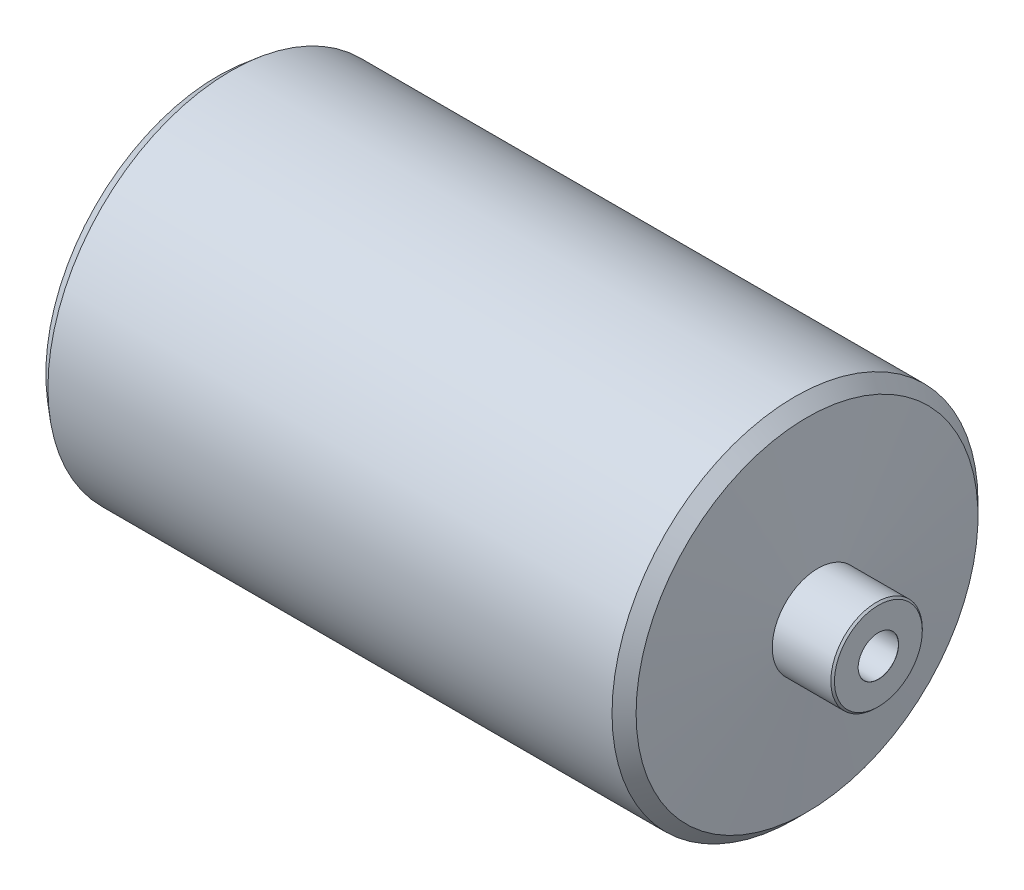
ISO-10303-21;
HEADER;
FILE_DESCRIPTION(('STEP AP214'),'2;1');
FILE_NAME('part.step','',(''),(''),'','','');
FILE_SCHEMA(('AUTOMOTIVE_DESIGN { 1 0 10303 214 1 1 1 1 }'));
ENDSEC;
DATA;
#1=APPLICATION_CONTEXT('core data for automotive mechanical design processes');
#2=APPLICATION_PROTOCOL_DEFINITION('international standard','automotive_design',2000,#1);
#3=PRODUCT_CONTEXT('',#1,'mechanical');
#4=PRODUCT('Part','Part','',(#3));
#5=PRODUCT_RELATED_PRODUCT_CATEGORY('part','',(#4));
#6=PRODUCT_DEFINITION_FORMATION('','',#4);
#7=PRODUCT_DEFINITION_CONTEXT('part definition',#1,'design');
#8=PRODUCT_DEFINITION('design','',#6,#7);
#9=PRODUCT_DEFINITION_SHAPE('','',#8);
#10=(LENGTH_UNIT() NAMED_UNIT(*) SI_UNIT(.MILLI.,.METRE.));
#11=(NAMED_UNIT(*) PLANE_ANGLE_UNIT() SI_UNIT($,.RADIAN.));
#12=(NAMED_UNIT(*) SI_UNIT($,.STERADIAN.) SOLID_ANGLE_UNIT());
#13=UNCERTAINTY_MEASURE_WITH_UNIT(LENGTH_MEASURE(1.E-05),#10,'distance_accuracy_value','');
#14=(GEOMETRIC_REPRESENTATION_CONTEXT(3) GLOBAL_UNCERTAINTY_ASSIGNED_CONTEXT((#13)) GLOBAL_UNIT_ASSIGNED_CONTEXT((#10,
#11,#12)) REPRESENTATION_CONTEXT('',''));
#15=CARTESIAN_POINT('',(0.,0.,0.));
#16=DIRECTION('',(0.,0.,1.));
#17=DIRECTION('',(1.,0.,0.));
#18=AXIS2_PLACEMENT_3D('',#15,#16,#17);
#19=CARTESIAN_POINT('',(0.,0.,0.));
#20=DIRECTION('',(-1.,0.,0.));
#21=DIRECTION('',(0.,0.,1.));
#22=AXIS2_PLACEMENT_3D('',#19,#20,#21);
#23=PLANE('',#22);
#24=CARTESIAN_POINT('',(0.,0.,0.));
#25=DIRECTION('',(-1.,0.,0.));
#26=DIRECTION('',(0.,0.,1.));
#27=AXIS2_PLACEMENT_3D('',#24,#25,#26);
#28=CIRCLE('',#27,5.525);
#29=CARTESIAN_POINT('',(0.,0.,5.525));
#30=VERTEX_POINT('',#29);
#31=EDGE_CURVE('E71',#30,#30,#28,.T.);
#32=ORIENTED_EDGE('',*,*,#31,.F.);
#33=EDGE_LOOP('',(#32));
#34=FACE_BOUND('',#33,.T.);
#35=CARTESIAN_POINT('',(0.,0.,0.));
#36=DIRECTION('',(-1.,0.,0.));
#37=DIRECTION('',(0.,0.,1.));
#38=AXIS2_PLACEMENT_3D('',#35,#36,#37);
#39=CIRCLE('',#38,12.);
#40=CARTESIAN_POINT('',(0.,0.,12.));
#41=VERTEX_POINT('',#40);
#42=EDGE_CURVE('E11',#41,#41,#39,.T.);
#43=ORIENTED_EDGE('',*,*,#42,.T.);
#44=EDGE_LOOP('',(#43));
#45=FACE_BOUND('',#44,.T.);
#46=ADVANCED_FACE('F39',(#34,#45),#23,.T.);
#47=CARTESIAN_POINT('',(200.,0.,0.));
#48=DIRECTION('',(1.,0.,0.));
#49=DIRECTION('',(0.,0.,-1.));
#50=AXIS2_PLACEMENT_3D('',#47,#48,#49);
#51=CYLINDRICAL_SURFACE('',#50,12.5);
#52=CARTESIAN_POINT('',(0.500000000000028,0.,0.));
#53=DIRECTION('',(-1.,0.,0.));
#54=DIRECTION('',(0.,0.,1.));
#55=AXIS2_PLACEMENT_3D('',#52,#53,#54);
#56=CIRCLE('',#55,12.5);
#57=CARTESIAN_POINT('',(0.500000000000028,0.,12.5));
#58=VERTEX_POINT('',#57);
#59=EDGE_CURVE('E48',#58,#58,#56,.F.);
#60=ORIENTED_EDGE('',*,*,#59,.T.);
#61=EDGE_LOOP('',(#60));
#62=FACE_BOUND('',#61,.T.);
#63=CARTESIAN_POINT('',(16.5,0.,0.));
#64=DIRECTION('',(1.,0.,0.));
#65=DIRECTION('',(0.,0.,-1.));
#66=AXIS2_PLACEMENT_3D('',#63,#64,#65);
#67=CIRCLE('',#66,12.5);
#68=CARTESIAN_POINT('',(16.5,0.,-12.5));
#69=VERTEX_POINT('',#68);
#70=EDGE_CURVE('E83',#69,#69,#67,.T.);
#71=ORIENTED_EDGE('',*,*,#70,.F.);
#72=EDGE_LOOP('',(#71));
#73=FACE_BOUND('',#72,.T.);
#74=ADVANCED_FACE('F106',(#62,#73),#51,.T.);
#75=CARTESIAN_POINT('',(19.780824882222,0.,0.));
#76=DIRECTION('',(1.,0.,0.));
#77=DIRECTION('',(0.,0.,-1.));
#78=AXIS2_PLACEMENT_3D('',#75,#76,#77);
#79=CONICAL_SURFACE('',#78,50.,1.48352986419518);
#80=CARTESIAN_POINT('',(19.5193576539791,0.,0.));
#81=DIRECTION('',(-1.,0.,0.));
#82=DIRECTION('',(0.,0.,1.));
#83=AXIS2_PLACEMENT_3D('',#80,#81,#82);
#84=CIRCLE('',#83,47.0114159057248);
#85=CARTESIAN_POINT('',(19.5193576539791,0.,-47.0114159057248));
#86=VERTEX_POINT('',#85);
#87=EDGE_CURVE('E95',#86,#86,#84,.T.);
#88=CARTESIAN_POINT('',(19.5193576539791,0.,-47.0114159057248));
#89=CARTESIAN_POINT('',(19.4879060117501,0.,-46.6519219900402));
#90=CARTESIAN_POINT('',(19.4564543695212,0.,-46.2924280743555));
#91=CARTESIAN_POINT('',(19.3935510850633,0.,-45.5734402429863));
#92=CARTESIAN_POINT('',(19.3620994428343,0.,-45.2139463273016));
#93=CARTESIAN_POINT('',(19.2991961583764,0.,-44.4949584959324));
#94=CARTESIAN_POINT('',(19.2677445161475,0.,-44.1354645802477));
#95=CARTESIAN_POINT('',(19.2048412316896,0.,-43.4164767488785));
#96=CARTESIAN_POINT('',(19.1733895894606,0.,-43.0569828331938));
#97=CARTESIAN_POINT('',(19.1104863050027,0.,-42.3379950018246));
#98=CARTESIAN_POINT('',(19.0790346627738,0.,-41.9785010861399));
#99=CARTESIAN_POINT('',(19.0161313783159,0.,-41.2595132547707));
#100=CARTESIAN_POINT('',(18.9846797360869,0.,-40.900019339086));
#101=CARTESIAN_POINT('',(18.921776451629,0.,-40.1810315077168));
#102=CARTESIAN_POINT('',(18.8903248094001,0.,-39.8215375920321));
#103=CARTESIAN_POINT('',(18.8274215249422,0.,-39.1025497606629));
#104=CARTESIAN_POINT('',(18.7959698827132,0.,-38.7430558449782));
#105=CARTESIAN_POINT('',(18.7330665982554,0.,-38.0240680136089));
#106=CARTESIAN_POINT('',(18.7016149560264,0.,-37.6645740979243));
#107=CARTESIAN_POINT('',(18.6387116715685,0.,-36.9455862665551));
#108=CARTESIAN_POINT('',(18.6072600293396,0.,-36.5860923508704));
#109=CARTESIAN_POINT('',(18.5443567448817,0.,-35.8671045195012));
#110=CARTESIAN_POINT('',(18.5129051026527,0.,-35.5076106038165));
#111=CARTESIAN_POINT('',(18.4500018181948,0.,-34.7886227724472));
#112=CARTESIAN_POINT('',(18.4185501759659,0.,-34.4291288567626));
#113=CARTESIAN_POINT('',(18.355646891508,0.,-33.7101410253933));
#114=CARTESIAN_POINT('',(18.324195249279,0.,-33.3506471097087));
#115=CARTESIAN_POINT('',(18.2612919648211,0.,-32.6316592783394));
#116=CARTESIAN_POINT('',(18.2298403225922,0.,-32.2721653626548));
#117=CARTESIAN_POINT('',(18.1669370381343,0.,-31.5531775312856));
#118=CARTESIAN_POINT('',(18.1354853959053,0.,-31.1936836156009));
#119=CARTESIAN_POINT('',(18.0725821114474,0.,-30.4746957842316));
#120=CARTESIAN_POINT('',(18.0411304692185,0.,-30.115201868547));
#121=CARTESIAN_POINT('',(17.9782271847606,0.,-29.3962140371777));
#122=CARTESIAN_POINT('',(17.9467755425316,0.,-29.0367201214931));
#123=CARTESIAN_POINT('',(17.8838722580737,0.,-28.3177322901238));
#124=CARTESIAN_POINT('',(17.8524206158448,0.,-27.9582383744392));
#125=CARTESIAN_POINT('',(17.7895173313869,0.,-27.2392505430699));
#126=CARTESIAN_POINT('',(17.7580656891579,0.,-26.8797566273853));
#127=CARTESIAN_POINT('',(17.6951624047001,0.,-26.160768796016));
#128=CARTESIAN_POINT('',(17.6637107624711,0.,-25.8012748803314));
#129=CARTESIAN_POINT('',(17.6008074780132,0.,-25.0822870489621));
#130=CARTESIAN_POINT('',(17.5693558357843,0.,-24.7227931332775));
#131=CARTESIAN_POINT('',(17.5064525513264,0.,-24.0038053019082));
#132=CARTESIAN_POINT('',(17.4750009090974,0.,-23.6443113862236));
#133=CARTESIAN_POINT('',(17.4120976246395,0.,-22.9253235548543));
#134=CARTESIAN_POINT('',(17.3806459824106,0.,-22.5658296391697));
#135=CARTESIAN_POINT('',(17.3177426979527,0.,-21.8468418078004));
#136=CARTESIAN_POINT('',(17.2862910557237,0.,-21.4873478921158));
#137=CARTESIAN_POINT('',(17.2233877712658,0.,-20.7683600607465));
#138=CARTESIAN_POINT('',(17.1919361290369,0.,-20.4088661450619));
#139=CARTESIAN_POINT('',(17.129032844579,0.,-19.6898783136926));
#140=CARTESIAN_POINT('',(17.09758120235,0.,-19.330384398008));
#141=CARTESIAN_POINT('',(17.0346779178921,0.,-18.6113965666387));
#142=CARTESIAN_POINT('',(17.0032262756632,0.,-18.2519026509541));
#143=CARTESIAN_POINT('',(16.9403229912053,0.,-17.5329148195848));
#144=CARTESIAN_POINT('',(16.9088713489763,0.,-17.1734209039002));
#145=CARTESIAN_POINT('',(16.8459680645184,0.,-16.4544330725309));
#146=CARTESIAN_POINT('',(16.8145164222895,0.,-16.0949391568463));
#147=CARTESIAN_POINT('',(16.7516131378316,0.,-15.375951325477));
#148=CARTESIAN_POINT('',(16.7201614956027,0.,-15.0164574097924));
#149=CARTESIAN_POINT('',(16.6572582111448,0.,-14.2974695784231));
#150=CARTESIAN_POINT('',(16.6258065689158,0.,-13.9379756627385));
#151=CARTESIAN_POINT('',(16.5629032844579,0.,-13.2189878313692));
#152=CARTESIAN_POINT('',(16.531451642229,0.,-12.8594939156846));
#153=CARTESIAN_POINT('',(16.5,0.,-12.5));
#154=B_SPLINE_CURVE_WITH_KNOTS('',3,(#88,#89,#90,#91,#92,#93,#94,#95,#96,#97,#98,#99,#100,#101,
#102,#103,#104,#105,#106,#107,#108,#109,#110,#111,#112,#113,#114,#115,#116,#117,#118,#119,#120,
#121,#122,#123,#124,#125,#126,#127,#128,#129,#130,#131,#132,#133,#134,#135,#136,#137,#138,#139,
#140,#141,#142,#143,#144,#145,#146,#147,#148,#149,#150,#151,#152,#153),.UNSPECIFIED.,.F.,.F.,(4,
2,2,2,2,2,2,2,2,2,2,2,2,2,2,2,2,2,2,2,2,2,2,2,2,2,2,2,2,2,2,2,4),(0.,1.08260137212111,
2.16520274424222,3.24780411636334,4.33040548848445,5.41300686060556,6.49560823272667,
7.57820960484778,8.6608109769689,9.74341234909001,10.8260137212111,11.9086150933322,
12.9912164654533,14.0738178375744,15.1564192096956,16.2390205818167,17.3216219539378,
18.4042233260589,19.48682469818,20.5694260703011,21.6520274424222,22.7346288145433,
23.8172301866644,24.8998315587856,25.9824329309067,27.0650343030278,28.1476356751489,
29.23023704727,30.3128384193911,31.3954397915122,32.4780411636333,33.5606425357544,
34.6432439078756),.UNSPECIFIED.);
#155=EDGE_CURVE('BSEAM128',#86,#69,#154,.T.);
#156=ORIENTED_EDGE('',*,*,#87,.T.);
#157=ORIENTED_EDGE('',*,*,#70,.T.);
#158=ORIENTED_EDGE('',*,*,#155,.T.);
#159=ORIENTED_EDGE('',*,*,#155,.F.);
#160=EDGE_LOOP('',(#156,#158,#157,#159));
#161=FACE_BOUND('',#160,.T.);
#162=ADVANCED_FACE('F128',(#161),#79,.T.);
#163=CARTESIAN_POINT('',(200.,0.,0.));
#164=DIRECTION('',(1.,0.,0.));
#165=DIRECTION('',(0.,0.,-1.));
#166=AXIS2_PLACEMENT_3D('',#163,#164,#165);
#167=CYLINDRICAL_SURFACE('',#166,50.);
#168=CARTESIAN_POINT('',(177.219175117778,0.,0.));
#169=DIRECTION('',(1.,0.,0.));
#170=DIRECTION('',(0.,0.,-1.));
#171=AXIS2_PLACEMENT_3D('',#168,#169,#170);
#172=CIRCLE('',#171,50.);
#173=CARTESIAN_POINT('',(177.219175117778,0.,-50.));
#174=VERTEX_POINT('',#173);
#175=EDGE_CURVE('E92',#174,#174,#172,.F.);
#176=ORIENTED_EDGE('',*,*,#175,.T.);
#177=EDGE_LOOP('',(#176));
#178=FACE_BOUND('',#177,.T.);
#179=CARTESIAN_POINT('',(23.0810134851014,0.,0.));
#180=DIRECTION('',(-1.,0.,0.));
#181=DIRECTION('',(0.,0.,1.));
#182=AXIS2_PLACEMENT_3D('',#179,#180,#181);
#183=CIRCLE('',#182,50.);
#184=CARTESIAN_POINT('',(23.0810134851014,0.,50.));
#185=VERTEX_POINT('',#184);
#186=EDGE_CURVE('E89',#185,#185,#183,.F.);
#187=ORIENTED_EDGE('',*,*,#186,.T.);
#188=EDGE_LOOP('',(#187));
#189=FACE_BOUND('',#188,.T.);
#190=ADVANCED_FACE('F158',(#178,#189),#167,.T.);
#191=CARTESIAN_POINT('',(183.5,0.,0.));
#192=DIRECTION('',(-1.,0.,0.));
#193=DIRECTION('',(0.,0.,1.));
#194=AXIS2_PLACEMENT_3D('',#191,#192,#193);
#195=CONICAL_SURFACE('',#194,12.5,1.48352986419518);
#196=CARTESIAN_POINT('',(180.506805506669,0.,0.));
#197=DIRECTION('',(1.,0.,0.));
#198=DIRECTION('',(0.,0.,-1.));
#199=AXIS2_PLACEMENT_3D('',#196,#197,#198);
#200=CIRCLE('',#199,46.7123696111087);
#201=CARTESIAN_POINT('',(180.506805506669,0.,46.712369611109));
#202=VERTEX_POINT('',#201);
#203=EDGE_CURVE('E86',#202,#202,#200,.T.);
#204=CARTESIAN_POINT('',(183.5,0.,0.));
#205=DIRECTION('',(1.,0.,0.));
#206=DIRECTION('',(0.,0.,-1.));
#207=AXIS2_PLACEMENT_3D('',#204,#205,#206);
#208=CIRCLE('',#207,12.5);
#209=CARTESIAN_POINT('',(183.5,0.,12.5000000000001));
#210=VERTEX_POINT('',#209);
#211=EDGE_CURVE('E80',#210,#210,#208,.T.);
#212=CARTESIAN_POINT('',(180.506805506669,0.,46.712369611109));
#213=CARTESIAN_POINT('',(180.537984615975,0.,46.3559907609933));
#214=CARTESIAN_POINT('',(180.56916372528,0.,45.9996119108776));
#215=CARTESIAN_POINT('',(180.631521943891,0.,45.2868542106461));
#216=CARTESIAN_POINT('',(180.662701053197,0.,44.9304753605304));
#217=CARTESIAN_POINT('',(180.725059271808,0.,44.217717660299));
#218=CARTESIAN_POINT('',(180.756238381113,0.,43.8613388101833));
#219=CARTESIAN_POINT('',(180.818596599725,0.,43.1485811099518));
#220=CARTESIAN_POINT('',(180.84977570903,0.,42.7922022598361));
#221=CARTESIAN_POINT('',(180.912133927641,0.,42.0794445596047));
#222=CARTESIAN_POINT('',(180.943313036947,0.,41.723065709489));
#223=CARTESIAN_POINT('',(181.005671255558,0.,41.0103080092575));
#224=CARTESIAN_POINT('',(181.036850364863,0.,40.6539291591418));
#225=CARTESIAN_POINT('',(181.099208583474,0.,39.9411714589104));
#226=CARTESIAN_POINT('',(181.13038769278,0.,39.5847926087947));
#227=CARTESIAN_POINT('',(181.192745911391,0.,38.8720349085632));
#228=CARTESIAN_POINT('',(181.223925020696,0.,38.5156560584475));
#229=CARTESIAN_POINT('',(181.286283239307,0.,37.8028983582161));
#230=CARTESIAN_POINT('',(181.317462348613,0.,37.4465195081004));
#231=CARTESIAN_POINT('',(181.379820567224,0.,36.7337618078689));
#232=CARTESIAN_POINT('',(181.41099967653,0.,36.3773829577532));
#233=CARTESIAN_POINT('',(181.473357895141,0.,35.6646252575218));
#234=CARTESIAN_POINT('',(181.504537004446,0.,35.308246407406));
#235=CARTESIAN_POINT('',(181.566895223057,0.,34.5954887071746));
#236=CARTESIAN_POINT('',(181.598074332363,0.,34.2391098570589));
#237=CARTESIAN_POINT('',(181.660432550974,0.,33.5263521568275));
#238=CARTESIAN_POINT('',(181.691611660279,0.,33.1699733067117));
#239=CARTESIAN_POINT('',(181.75396987889,0.,32.4572156064803));
#240=CARTESIAN_POINT('',(181.785148988196,0.,32.1008367563646));
#241=CARTESIAN_POINT('',(181.847507206807,0.,31.3880790561332));
#242=CARTESIAN_POINT('',(181.878686316113,0.,31.0317002060174));
#243=CARTESIAN_POINT('',(181.941044534724,0.,30.318942505786));
#244=CARTESIAN_POINT('',(181.972223644029,0.,29.9625636556703));
#245=CARTESIAN_POINT('',(182.03458186264,0.,29.2498059554388));
#246=CARTESIAN_POINT('',(182.065760971946,0.,28.8934271053231));
#247=CARTESIAN_POINT('',(182.128119190557,0.,28.1806694050917));
#248=CARTESIAN_POINT('',(182.159298299862,0.,27.824290554976));
#249=CARTESIAN_POINT('',(182.221656518473,0.,27.1115328547445));
#250=CARTESIAN_POINT('',(182.252835627779,0.,26.7551540046288));
#251=CARTESIAN_POINT('',(182.31519384639,0.,26.0423963043974));
#252=CARTESIAN_POINT('',(182.346372955695,0.,25.6860174542817));
#253=CARTESIAN_POINT('',(182.408731174306,0.,24.9732597540502));
#254=CARTESIAN_POINT('',(182.439910283612,0.,24.6168809039345));
#255=CARTESIAN_POINT('',(182.502268502223,0.,23.9041232037031));
#256=CARTESIAN_POINT('',(182.533447611529,0.,23.5477443535874));
#257=CARTESIAN_POINT('',(182.59580583014,0.,22.8349866533559));
#258=CARTESIAN_POINT('',(182.626984939445,0.,22.4786078032402));
#259=CARTESIAN_POINT('',(182.689343158056,0.,21.7658501030088));
#260=CARTESIAN_POINT('',(182.720522267362,0.,21.4094712528931));
#261=CARTESIAN_POINT('',(182.782880485973,0.,20.6967135526616));
#262=CARTESIAN_POINT('',(182.814059595278,0.,20.3403347025459));
#263=CARTESIAN_POINT('',(182.876417813889,0.,19.6275770023145));
#264=CARTESIAN_POINT('',(182.907596923195,0.,19.2711981521988));
#265=CARTESIAN_POINT('',(182.969955141806,0.,18.5584404519673));
#266=CARTESIAN_POINT('',(183.001134251112,0.,18.2020616018516));
#267=CARTESIAN_POINT('',(183.063492469723,0.,17.4893039016202));
#268=CARTESIAN_POINT('',(183.094671579028,0.,17.1329250515045));
#269=CARTESIAN_POINT('',(183.157029797639,0.,16.420167351273));
#270=CARTESIAN_POINT('',(183.188208906945,0.,16.0637885011573));
#271=CARTESIAN_POINT('',(183.250567125556,0.,15.3510308009259));
#272=CARTESIAN_POINT('',(183.281746234861,0.,14.9946519508102));
#273=CARTESIAN_POINT('',(183.344104453472,0.,14.2818942505787));
#274=CARTESIAN_POINT('',(183.375283562778,0.,13.925515400463));
#275=CARTESIAN_POINT('',(183.437641781389,0.,13.2127577002316));
#276=CARTESIAN_POINT('',(183.468820890694,0.,12.8563788501159));
#277=CARTESIAN_POINT('',(183.5,0.,12.5000000000001));
#278=B_SPLINE_CURVE_WITH_KNOTS('',3,(#212,#213,#214,#215,#216,#217,#218,#219,#220,#221,#222,
#223,#224,#225,#226,#227,#228,#229,#230,#231,#232,#233,#234,#235,#236,#237,#238,#239,#240,#241,
#242,#243,#244,#245,#246,#247,#248,#249,#250,#251,#252,#253,#254,#255,#256,#257,#258,#259,#260,
#261,#262,#263,#264,#265,#266,#267,#268,#269,#270,#271,#272,#273,#274,#275,#276,#277),
.UNSPECIFIED.,.F.,.F.,(4,2,2,2,2,2,2,2,2,2,2,2,2,2,2,2,2,2,2,2,2,2,2,2,2,2,2,2,2,2,2,2,4),(0.,
1.07322047828113,2.14644095656227,3.2196614348434,4.29288191312453,5.36610239140566,
6.4393228696868,7.51254334796793,8.58576382624906,9.65898430453019,10.7322047828113,
11.8054252610925,12.8786457393736,13.9518662176547,15.0250866959359,16.098307174217,
17.1715276524981,18.2447481307793,19.3179686090604,20.3911890873415,21.4644095656227,
22.5376300439038,23.6108505221849,24.6840710004661,25.7572914787472,26.8305119570283,
27.9037324353095,28.9769529135906,30.0501733918717,31.1233938701529,32.196614348434,
33.2698348267151,34.3430553049963),.UNSPECIFIED.);
#279=EDGE_CURVE('BSEAM160',#202,#210,#278,.T.);
#280=ORIENTED_EDGE('',*,*,#203,.T.);
#281=ORIENTED_EDGE('',*,*,#211,.F.);
#282=ORIENTED_EDGE('',*,*,#279,.T.);
#283=ORIENTED_EDGE('',*,*,#279,.F.);
#284=EDGE_LOOP('',(#280,#282,#281,#283));
#285=FACE_BOUND('',#284,.T.);
#286=ADVANCED_FACE('F160',(#285),#195,.T.);
#287=CARTESIAN_POINT('',(200.,0.,0.));
#288=DIRECTION('',(1.,0.,0.));
#289=DIRECTION('',(0.,0.,-1.));
#290=AXIS2_PLACEMENT_3D('',#287,#288,#289);
#291=CYLINDRICAL_SURFACE('',#290,12.5);
#292=CARTESIAN_POINT('',(199.5,0.,0.));
#293=DIRECTION('',(1.,0.,0.));
#294=DIRECTION('',(0.,0.,-1.));
#295=AXIS2_PLACEMENT_3D('',#292,#293,#294);
#296=CIRCLE('',#295,12.5);
#297=CARTESIAN_POINT('',(199.5,0.,-12.5));
#298=VERTEX_POINT('',#297);
#299=EDGE_CURVE('E101',#298,#298,#296,.F.);
#300=ORIENTED_EDGE('',*,*,#299,.T.);
#301=EDGE_LOOP('',(#300));
#302=FACE_BOUND('',#301,.T.);
#303=ORIENTED_EDGE('',*,*,#211,.T.);
#304=EDGE_LOOP('',(#303));
#305=FACE_BOUND('',#304,.T.);
#306=ADVANCED_FACE('F167',(#302,#305),#291,.T.);
#307=CARTESIAN_POINT('',(200.,0.,-12.5));
#308=DIRECTION('',(1.,0.,0.));
#309=DIRECTION('',(0.,0.,-1.));
#310=AXIS2_PLACEMENT_3D('',#307,#308,#309);
#311=PLANE('',#310);
#312=CARTESIAN_POINT('',(200.,0.,0.));
#313=DIRECTION('',(1.,0.,0.));
#314=DIRECTION('',(0.,0.,-1.));
#315=AXIS2_PLACEMENT_3D('',#312,#313,#314);
#316=CIRCLE('',#315,5.525);
#317=CARTESIAN_POINT('',(200.,0.,-5.525));
#318=VERTEX_POINT('',#317);
#319=EDGE_CURVE('E64',#318,#318,#316,.T.);
#320=ORIENTED_EDGE('',*,*,#319,.F.);
#321=EDGE_LOOP('',(#320));
#322=FACE_BOUND('',#321,.T.);
#323=CARTESIAN_POINT('',(200.,0.,0.));
#324=DIRECTION('',(1.,0.,0.));
#325=DIRECTION('',(0.,0.,-1.));
#326=AXIS2_PLACEMENT_3D('',#323,#324,#325);
#327=CIRCLE('',#326,12.);
#328=CARTESIAN_POINT('',(200.,0.,-12.));
#329=VERTEX_POINT('',#328);
#330=EDGE_CURVE('E98',#329,#329,#327,.T.);
#331=ORIENTED_EDGE('',*,*,#330,.T.);
#332=EDGE_LOOP('',(#331));
#333=FACE_BOUND('',#332,.T.);
#334=ADVANCED_FACE('F141',(#322,#333),#311,.T.);
#335=CARTESIAN_POINT('',(180.506805506669,0.,0.));
#336=DIRECTION('',(-1.,0.,0.));
#337=DIRECTION('',(0.,0.,1.));
#338=AXIS2_PLACEMENT_3D('',#335,#336,#337);
#339=CONICAL_SURFACE('',#338,46.7123696111087,0.785398163397443);
#340=ORIENTED_EDGE('',*,*,#175,.F.);
#341=EDGE_LOOP('',(#340));
#342=FACE_BOUND('',#341,.T.);
#343=ORIENTED_EDGE('',*,*,#203,.F.);
#344=EDGE_LOOP('',(#343));
#345=FACE_BOUND('',#344,.T.);
#346=ADVANCED_FACE('F135',(#342,#345),#339,.T.);
#347=CARTESIAN_POINT('',(23.0810134851015,0.,0.));
#348=DIRECTION('',(1.,0.,0.));
#349=DIRECTION('',(0.,0.,-1.));
#350=AXIS2_PLACEMENT_3D('',#347,#348,#349);
#351=CONICAL_SURFACE('',#350,50.,0.698131700797734);
#352=ORIENTED_EDGE('',*,*,#87,.F.);
#353=EDGE_LOOP('',(#352));
#354=FACE_BOUND('',#353,.T.);
#355=ORIENTED_EDGE('',*,*,#186,.F.);
#356=EDGE_LOOP('',(#355));
#357=FACE_BOUND('',#356,.T.);
#358=ADVANCED_FACE('F119',(#354,#357),#351,.T.);
#359=CARTESIAN_POINT('',(200.,0.,0.));
#360=DIRECTION('',(-1.,0.,0.));
#361=DIRECTION('',(0.,0.,1.));
#362=AXIS2_PLACEMENT_3D('',#359,#360,#361);
#363=CONICAL_SURFACE('',#362,12.,0.785398163397441);
#364=ORIENTED_EDGE('',*,*,#299,.F.);
#365=EDGE_LOOP('',(#364));
#366=FACE_BOUND('',#365,.T.);
#367=ORIENTED_EDGE('',*,*,#330,.F.);
#368=EDGE_LOOP('',(#367));
#369=FACE_BOUND('',#368,.T.);
#370=ADVANCED_FACE('F111',(#366,#369),#363,.T.);
#371=CARTESIAN_POINT('',(0.500000000000028,0.,0.));
#372=DIRECTION('',(1.,0.,0.));
#373=DIRECTION('',(0.,0.,-1.));
#374=AXIS2_PLACEMENT_3D('',#371,#372,#373);
#375=CONICAL_SURFACE('',#374,12.5,0.785398163397441);
#376=ORIENTED_EDGE('',*,*,#42,.F.);
#377=EDGE_LOOP('',(#376));
#378=FACE_BOUND('',#377,.T.);
#379=ORIENTED_EDGE('',*,*,#59,.F.);
#380=EDGE_LOOP('',(#379));
#381=FACE_BOUND('',#380,.T.);
#382=ADVANCED_FACE('F42',(#378,#381),#375,.T.);
#383=CARTESIAN_POINT('',(144.304733404652,0.,0.));
#384=DIRECTION('',(1.,0.,0.));
#385=DIRECTION('',(0.,0.,-1.));
#386=AXIS2_PLACEMENT_3D('',#383,#384,#385);
#387=CONICAL_SURFACE('',#386,5.5,1.02974425867666);
#388=CARTESIAN_POINT('',(141.,0.,0.));
#389=VERTEX_POINT('',#388);
#390=VERTEX_LOOP('',#389);
#391=FACE_BOUND('',#390,.T.);
#392=CARTESIAN_POINT('',(144.304733404652,0.,0.));
#393=DIRECTION('',(1.,0.,0.));
#394=DIRECTION('',(0.,0.,-1.));
#395=AXIS2_PLACEMENT_3D('',#392,#393,#394);
#396=CIRCLE('',#395,5.5);
#397=CARTESIAN_POINT('',(144.304733404652,0.,-5.5));
#398=VERTEX_POINT('',#397);
#399=EDGE_CURVE('E77',#398,#398,#396,.T.);
#400=ORIENTED_EDGE('',*,*,#399,.T.);
#401=EDGE_LOOP('',(#400));
#402=FACE_BOUND('',#401,.T.);
#403=ADVANCED_FACE('F110',(#391,#402),#387,.F.);
#404=CARTESIAN_POINT('',(200.,0.,0.));
#405=DIRECTION('',(1.,0.,0.));
#406=DIRECTION('',(0.,0.,-1.));
#407=AXIS2_PLACEMENT_3D('',#404,#405,#406);
#408=CYLINDRICAL_SURFACE('',#407,5.5);
#409=ORIENTED_EDGE('',*,*,#399,.F.);
#410=EDGE_LOOP('',(#409));
#411=FACE_BOUND('',#410,.T.);
#412=CARTESIAN_POINT('',(199.975,0.,0.));
#413=DIRECTION('',(1.,0.,0.));
#414=DIRECTION('',(0.,0.,-1.));
#415=AXIS2_PLACEMENT_3D('',#412,#413,#414);
#416=CIRCLE('',#415,5.5);
#417=CARTESIAN_POINT('',(199.975,0.,-5.5));
#418=VERTEX_POINT('',#417);
#419=EDGE_CURVE('E68',#418,#418,#416,.T.);
#420=ORIENTED_EDGE('',*,*,#419,.T.);
#421=EDGE_LOOP('',(#420));
#422=FACE_BOUND('',#421,.T.);
#423=ADVANCED_FACE('F117',(#411,#422),#408,.F.);
#424=CARTESIAN_POINT('',(200.,0.,0.));
#425=DIRECTION('',(1.,0.,0.));
#426=DIRECTION('',(0.,0.,-1.));
#427=AXIS2_PLACEMENT_3D('',#424,#425,#426);
#428=CONICAL_SURFACE('',#427,5.525,0.785398163397518);
#429=ORIENTED_EDGE('',*,*,#419,.F.);
#430=EDGE_LOOP('',(#429));
#431=FACE_BOUND('',#430,.T.);
#432=ORIENTED_EDGE('',*,*,#319,.T.);
#433=EDGE_LOOP('',(#432));
#434=FACE_BOUND('',#433,.T.);
#435=ADVANCED_FACE('F58',(#431,#434),#428,.F.);
#436=CARTESIAN_POINT('',(55.6952665953484,0.,0.));
#437=DIRECTION('',(-1.,0.,0.));
#438=DIRECTION('',(0.,0.,1.));
#439=AXIS2_PLACEMENT_3D('',#436,#437,#438);
#440=CONICAL_SURFACE('',#439,5.5,1.02974425867665);
#441=CARTESIAN_POINT('',(59.,0.,0.));
#442=VERTEX_POINT('',#441);
#443=VERTEX_LOOP('',#442);
#444=FACE_BOUND('',#443,.T.);
#445=CARTESIAN_POINT('',(55.6952665953484,0.,0.));
#446=DIRECTION('',(-1.,0.,0.));
#447=DIRECTION('',(0.,0.,1.));
#448=AXIS2_PLACEMENT_3D('',#445,#446,#447);
#449=CIRCLE('',#448,5.5);
#450=CARTESIAN_POINT('',(55.6952665953484,0.,5.5));
#451=VERTEX_POINT('',#450);
#452=EDGE_CURVE('E62',#451,#451,#449,.T.);
#453=ORIENTED_EDGE('',*,*,#452,.T.);
#454=EDGE_LOOP('',(#453));
#455=FACE_BOUND('',#454,.T.);
#456=ADVANCED_FACE('F54',(#444,#455),#440,.F.);
#457=CARTESIAN_POINT('',(0.,0.,0.));
#458=DIRECTION('',(-1.,0.,0.));
#459=DIRECTION('',(0.,0.,1.));
#460=AXIS2_PLACEMENT_3D('',#457,#458,#459);
#461=CYLINDRICAL_SURFACE('',#460,5.5);
#462=ORIENTED_EDGE('',*,*,#452,.F.);
#463=EDGE_LOOP('',(#462));
#464=FACE_BOUND('',#463,.T.);
#465=CARTESIAN_POINT('',(0.0249999999999988,0.,0.));
#466=DIRECTION('',(-1.,0.,0.));
#467=DIRECTION('',(0.,0.,1.));
#468=AXIS2_PLACEMENT_3D('',#465,#466,#467);
#469=CIRCLE('',#468,5.5);
#470=CARTESIAN_POINT('',(0.0249999999999988,0.,5.5));
#471=VERTEX_POINT('',#470);
#472=EDGE_CURVE('E65',#471,#471,#469,.T.);
#473=ORIENTED_EDGE('',*,*,#472,.T.);
#474=EDGE_LOOP('',(#473));
#475=FACE_BOUND('',#474,.T.);
#476=ADVANCED_FACE('F57',(#464,#475),#461,.F.);
#477=CARTESIAN_POINT('',(0.,0.,0.));
#478=DIRECTION('',(-1.,0.,0.));
#479=DIRECTION('',(0.,0.,1.));
#480=AXIS2_PLACEMENT_3D('',#477,#478,#479);
#481=CONICAL_SURFACE('',#480,5.525,0.78539816339747);
#482=ORIENTED_EDGE('',*,*,#472,.F.);
#483=EDGE_LOOP('',(#482));
#484=FACE_BOUND('',#483,.T.);
#485=ORIENTED_EDGE('',*,*,#31,.T.);
#486=EDGE_LOOP('',(#485));
#487=FACE_BOUND('',#486,.T.);
#488=ADVANCED_FACE('F186',(#484,#487),#481,.F.);
#489=CLOSED_SHELL('',(#46,#74,#162,#190,#286,#306,#334,#346,#358,#370,#382,#403,#423,#435,#456,
#476,#488));
#490=MANIFOLD_SOLID_BREP('B2',#489);
#491=ADVANCED_BREP_SHAPE_REPRESENTATION('',(#18,#490),#14);
#492=SHAPE_DEFINITION_REPRESENTATION(#9,#491);
ENDSEC;
END-ISO-10303-21;
